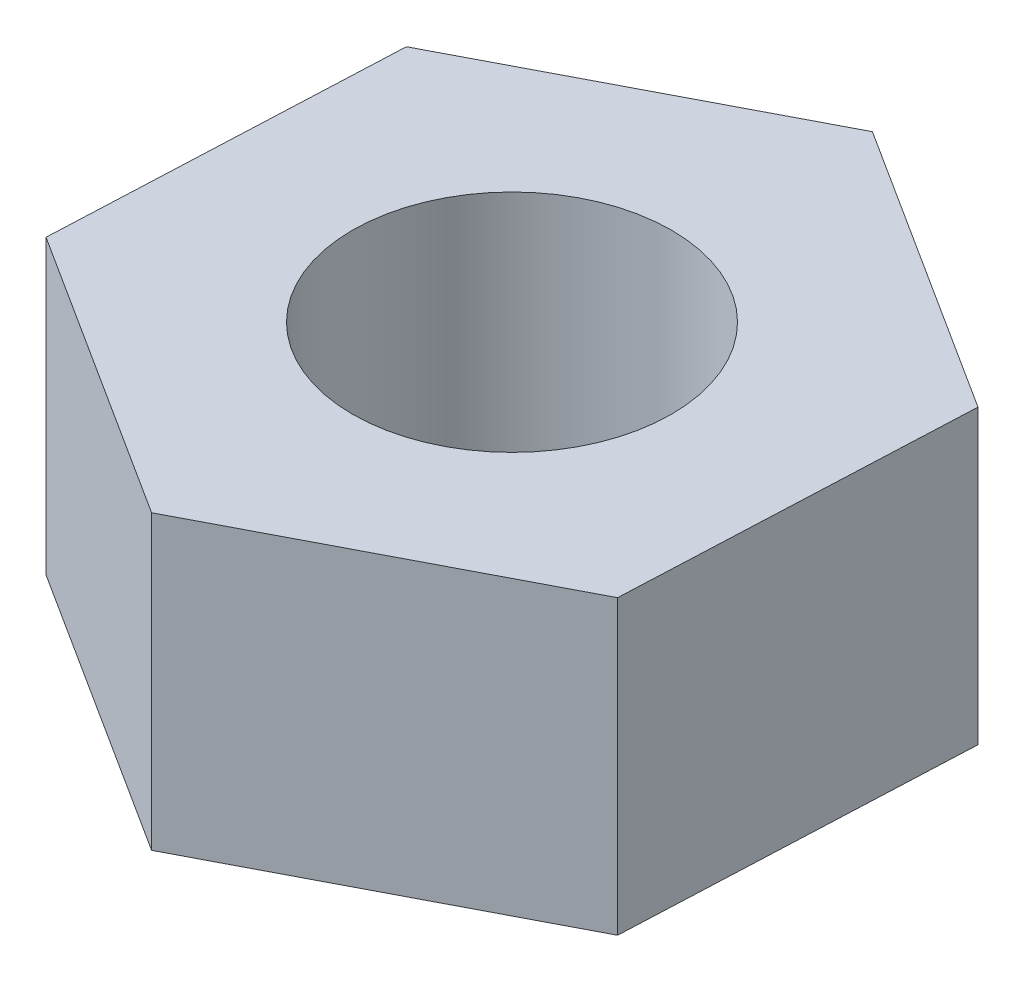
ISO-10303-21;
HEADER;
FILE_DESCRIPTION(('STEP AP214'),'2;1');
FILE_NAME('part.step','',(''),(''),'','','');
FILE_SCHEMA(('AUTOMOTIVE_DESIGN { 1 0 10303 214 1 1 1 1 }'));
ENDSEC;
DATA;
#1=APPLICATION_CONTEXT('core data for automotive mechanical design processes');
#2=APPLICATION_PROTOCOL_DEFINITION('international standard','automotive_design',2000,#1);
#3=PRODUCT_CONTEXT('',#1,'mechanical');
#4=PRODUCT('Part','Part','',(#3));
#5=PRODUCT_RELATED_PRODUCT_CATEGORY('part','',(#4));
#6=PRODUCT_DEFINITION_FORMATION('','',#4);
#7=PRODUCT_DEFINITION_CONTEXT('part definition',#1,'design');
#8=PRODUCT_DEFINITION('design','',#6,#7);
#9=PRODUCT_DEFINITION_SHAPE('','',#8);
#10=(LENGTH_UNIT() NAMED_UNIT(*) SI_UNIT(.MILLI.,.METRE.));
#11=(NAMED_UNIT(*) PLANE_ANGLE_UNIT() SI_UNIT($,.RADIAN.));
#12=(NAMED_UNIT(*) SI_UNIT($,.STERADIAN.) SOLID_ANGLE_UNIT());
#13=UNCERTAINTY_MEASURE_WITH_UNIT(LENGTH_MEASURE(1.E-05),#10,'distance_accuracy_value','');
#14=(GEOMETRIC_REPRESENTATION_CONTEXT(3) GLOBAL_UNCERTAINTY_ASSIGNED_CONTEXT((#13)) GLOBAL_UNIT_ASSIGNED_CONTEXT((#10,
#11,#12)) REPRESENTATION_CONTEXT('',''));
#15=CARTESIAN_POINT('',(0.,0.,0.));
#16=DIRECTION('',(0.,0.,1.));
#17=DIRECTION('',(1.,0.,0.));
#18=AXIS2_PLACEMENT_3D('',#15,#16,#17);
#19=CARTESIAN_POINT('',(-0.285815994218681,5.5,6.49371305321147));
#20=DIRECTION('',(-0.461435786892992,0.,-0.887173610165702));
#21=DIRECTION('',(-0.887173610165702,0.,0.461435786892992));
#22=AXIS2_PLACEMENT_3D('',#19,#20,#21);
#23=PLANE('',#22);
#24=DIRECTION('',(0.887173610165702,0.,-0.461435786892992));
#25=VECTOR('',#24,1.);
#26=CARTESIAN_POINT('',(-0.285815994218681,0.,6.49371305321147));
#27=LINE('',#26,#25);
#28=CARTESIAN_POINT('',(-0.285815994218681,0.,6.49371305321147));
#29=VERTEX_POINT('',#28);
#30=CARTESIAN_POINT('',(5.4808124718584,0.,3.49438043840702));
#31=VERTEX_POINT('',#30);
#32=EDGE_CURVE('E116',#29,#31,#27,.T.);
#33=ORIENTED_EDGE('',*,*,#32,.T.);
#34=DIRECTION('',(0.,-1.,0.));
#35=VECTOR('',#34,1.);
#36=CARTESIAN_POINT('',(5.4808124718584,5.5,3.49438043840702));
#37=LINE('',#36,#35);
#38=CARTESIAN_POINT('',(5.4808124718584,5.5,3.49438043840702));
#39=VERTEX_POINT('',#38);
#40=EDGE_CURVE('E11',#39,#31,#37,.T.);
#41=ORIENTED_EDGE('',*,*,#40,.F.);
#42=DIRECTION('',(0.887173610165702,0.,-0.461435786892992));
#43=VECTOR('',#42,1.);
#44=CARTESIAN_POINT('',(-0.285815994218681,5.5,6.49371305321147));
#45=LINE('',#44,#43);
#46=CARTESIAN_POINT('',(-0.285815994218681,5.5,6.49371305321147));
#47=VERTEX_POINT('',#46);
#48=EDGE_CURVE('E127',#47,#39,#45,.T.);
#49=ORIENTED_EDGE('',*,*,#48,.F.);
#50=DIRECTION('',(0.,-1.,0.));
#51=VECTOR('',#50,1.);
#52=CARTESIAN_POINT('',(-0.285815994218681,5.5,6.49371305321147));
#53=LINE('',#52,#51);
#54=EDGE_CURVE('E112',#47,#29,#53,.T.);
#55=ORIENTED_EDGE('',*,*,#54,.T.);
#56=EDGE_LOOP('',(#33,#41,#49,#55));
#57=FACE_BOUND('',#56,.T.);
#58=ADVANCED_FACE('F32',(#57),#23,.F.);
#59=CARTESIAN_POINT('',(5.4808124718584,5.5,3.49438043840702));
#60=DIRECTION('',(-0.999032777417146,0.,-0.0439716914182564));
#61=DIRECTION('',(-0.0439716914182564,0.,0.999032777417146));
#62=AXIS2_PLACEMENT_3D('',#59,#60,#61);
#63=PLANE('',#62);
#64=DIRECTION('',(0.0439716914182564,0.,-0.999032777417146));
#65=VECTOR('',#64,1.);
#66=CARTESIAN_POINT('',(5.4808124718584,0.,3.49438043840702));
#67=LINE('',#66,#65);
#68=CARTESIAN_POINT('',(5.76662846607707,0.,-2.99933261480445));
#69=VERTEX_POINT('',#68);
#70=EDGE_CURVE('E119',#31,#69,#67,.T.);
#71=ORIENTED_EDGE('',*,*,#70,.T.);
#72=DIRECTION('',(0.,-1.,0.));
#73=VECTOR('',#72,1.);
#74=CARTESIAN_POINT('',(5.76662846607707,5.5,-2.99933261480445));
#75=LINE('',#74,#73);
#76=CARTESIAN_POINT('',(5.76662846607707,5.5,-2.99933261480445));
#77=VERTEX_POINT('',#76);
#78=EDGE_CURVE('E40',#77,#69,#75,.T.);
#79=ORIENTED_EDGE('',*,*,#78,.F.);
#80=DIRECTION('',(0.0439716914182564,0.,-0.999032777417146));
#81=VECTOR('',#80,1.);
#82=CARTESIAN_POINT('',(5.4808124718584,5.5,3.49438043840702));
#83=LINE('',#82,#81);
#84=EDGE_CURVE('E85',#39,#77,#83,.T.);
#85=ORIENTED_EDGE('',*,*,#84,.F.);
#86=ORIENTED_EDGE('',*,*,#40,.T.);
#87=EDGE_LOOP('',(#71,#79,#85,#86));
#88=FACE_BOUND('',#87,.T.);
#89=ADVANCED_FACE('F153',(#88),#63,.F.);
#90=CARTESIAN_POINT('',(5.76662846607707,5.5,-2.99933261480445));
#91=DIRECTION('',(-0.537596990524155,0.,0.843201918747444));
#92=DIRECTION('',(0.843201918747444,0.,0.537596990524155));
#93=AXIS2_PLACEMENT_3D('',#90,#91,#92);
#94=PLANE('',#93);
#95=DIRECTION('',(-0.843201918747444,0.,-0.537596990524155));
#96=VECTOR('',#95,1.);
#97=CARTESIAN_POINT('',(5.76662846607707,0.,-2.99933261480445));
#98=LINE('',#97,#96);
#99=CARTESIAN_POINT('',(0.285815994218677,0.,-6.49371305321146));
#100=VERTEX_POINT('',#99);
#101=EDGE_CURVE('E122',#69,#100,#98,.T.);
#102=ORIENTED_EDGE('',*,*,#101,.T.);
#103=DIRECTION('',(0.,-1.,0.));
#104=VECTOR('',#103,1.);
#105=CARTESIAN_POINT('',(0.285815994218677,5.5,-6.49371305321146));
#106=LINE('',#105,#104);
#107=CARTESIAN_POINT('',(0.285815994218677,5.5,-6.49371305321146));
#108=VERTEX_POINT('',#107);
#109=EDGE_CURVE('E107',#108,#100,#106,.T.);
#110=ORIENTED_EDGE('',*,*,#109,.F.);
#111=DIRECTION('',(-0.843201918747444,0.,-0.537596990524155));
#112=VECTOR('',#111,1.);
#113=CARTESIAN_POINT('',(5.76662846607707,5.5,-2.99933261480445));
#114=LINE('',#113,#112);
#115=EDGE_CURVE('E98',#77,#108,#114,.T.);
#116=ORIENTED_EDGE('',*,*,#115,.F.);
#117=ORIENTED_EDGE('',*,*,#78,.T.);
#118=EDGE_LOOP('',(#102,#110,#116,#117));
#119=FACE_BOUND('',#118,.T.);
#120=ADVANCED_FACE('F133',(#119),#94,.F.);
#121=CARTESIAN_POINT('',(0.285815994218677,5.5,-6.49371305321146));
#122=DIRECTION('',(0.461435786892992,0.,0.887173610165702));
#123=DIRECTION('',(0.887173610165702,0.,-0.461435786892992));
#124=AXIS2_PLACEMENT_3D('',#121,#122,#123);
#125=PLANE('',#124);
#126=DIRECTION('',(-0.887173610165702,0.,0.461435786892992));
#127=VECTOR('',#126,1.);
#128=CARTESIAN_POINT('',(0.285815994218677,0.,-6.49371305321146));
#129=LINE('',#128,#127);
#130=CARTESIAN_POINT('',(-5.48081247185839,0.,-3.49438043840701));
#131=VERTEX_POINT('',#130);
#132=EDGE_CURVE('E106',#100,#131,#129,.T.);
#133=ORIENTED_EDGE('',*,*,#132,.T.);
#134=DIRECTION('',(0.,-1.,0.));
#135=VECTOR('',#134,1.);
#136=CARTESIAN_POINT('',(-5.48081247185839,5.5,-3.49438043840701));
#137=LINE('',#136,#135);
#138=CARTESIAN_POINT('',(-5.48081247185839,5.5,-3.49438043840701));
#139=VERTEX_POINT('',#138);
#140=EDGE_CURVE('E103',#139,#131,#137,.T.);
#141=ORIENTED_EDGE('',*,*,#140,.F.);
#142=DIRECTION('',(-0.887173610165702,0.,0.461435786892992));
#143=VECTOR('',#142,1.);
#144=CARTESIAN_POINT('',(0.285815994218677,5.5,-6.49371305321146));
#145=LINE('',#144,#143);
#146=EDGE_CURVE('E92',#108,#139,#145,.T.);
#147=ORIENTED_EDGE('',*,*,#146,.F.);
#148=ORIENTED_EDGE('',*,*,#109,.T.);
#149=EDGE_LOOP('',(#133,#141,#147,#148));
#150=FACE_BOUND('',#149,.T.);
#151=ADVANCED_FACE('F104',(#150),#125,.F.);
#152=CARTESIAN_POINT('',(-5.48081247185839,5.5,-3.49438043840701));
#153=DIRECTION('',(0.999032777417146,0.,0.0439716914182575));
#154=DIRECTION('',(0.0439716914182575,0.,-0.999032777417146));
#155=AXIS2_PLACEMENT_3D('',#152,#153,#154);
#156=PLANE('',#155);
#157=DIRECTION('',(-0.0439716914182575,0.,0.999032777417146));
#158=VECTOR('',#157,1.);
#159=CARTESIAN_POINT('',(-5.48081247185839,0.,-3.49438043840701));
#160=LINE('',#159,#158);
#161=CARTESIAN_POINT('',(-5.76662846607707,0.,2.99933261480446));
#162=VERTEX_POINT('',#161);
#163=EDGE_CURVE('E71',#131,#162,#160,.T.);
#164=ORIENTED_EDGE('',*,*,#163,.T.);
#165=DIRECTION('',(0.,-1.,0.));
#166=VECTOR('',#165,1.);
#167=CARTESIAN_POINT('',(-5.76662846607707,5.5,2.99933261480446));
#168=LINE('',#167,#166);
#169=CARTESIAN_POINT('',(-5.76662846607707,5.5,2.99933261480446));
#170=VERTEX_POINT('',#169);
#171=EDGE_CURVE('E108',#170,#162,#168,.T.);
#172=ORIENTED_EDGE('',*,*,#171,.F.);
#173=DIRECTION('',(-0.0439716914182575,0.,0.999032777417146));
#174=VECTOR('',#173,1.);
#175=CARTESIAN_POINT('',(-5.48081247185839,5.5,-3.49438043840701));
#176=LINE('',#175,#174);
#177=EDGE_CURVE('E96',#139,#170,#176,.T.);
#178=ORIENTED_EDGE('',*,*,#177,.F.);
#179=ORIENTED_EDGE('',*,*,#140,.T.);
#180=EDGE_LOOP('',(#164,#172,#178,#179));
#181=FACE_BOUND('',#180,.T.);
#182=ADVANCED_FACE('F110',(#181),#156,.F.);
#183=CARTESIAN_POINT('',(-5.76662846607707,5.5,2.99933261480446));
#184=DIRECTION('',(0.537596990524156,0.,-0.843201918747444));
#185=DIRECTION('',(-0.843201918747444,0.,-0.537596990524156));
#186=AXIS2_PLACEMENT_3D('',#183,#184,#185);
#187=PLANE('',#186);
#188=DIRECTION('',(0.843201918747444,0.,0.537596990524156));
#189=VECTOR('',#188,1.);
#190=CARTESIAN_POINT('',(-5.76662846607707,0.,2.99933261480446));
#191=LINE('',#190,#189);
#192=EDGE_CURVE('E77',#162,#29,#191,.T.);
#193=ORIENTED_EDGE('',*,*,#192,.T.);
#194=ORIENTED_EDGE('',*,*,#54,.F.);
#195=DIRECTION('',(0.843201918747444,0.,0.537596990524156));
#196=VECTOR('',#195,1.);
#197=CARTESIAN_POINT('',(-5.76662846607707,5.5,2.99933261480446));
#198=LINE('',#197,#196);
#199=EDGE_CURVE('E48',#170,#47,#198,.T.);
#200=ORIENTED_EDGE('',*,*,#199,.F.);
#201=ORIENTED_EDGE('',*,*,#171,.T.);
#202=EDGE_LOOP('',(#193,#194,#200,#201));
#203=FACE_BOUND('',#202,.T.);
#204=ADVANCED_FACE('F140',(#203),#187,.F.);
#205=CARTESIAN_POINT('',(0.,5.5,0.));
#206=DIRECTION('',(0.,1.,0.));
#207=DIRECTION('',(0.,0.,1.));
#208=AXIS2_PLACEMENT_3D('',#205,#206,#207);
#209=PLANE('',#208);
#210=CARTESIAN_POINT('',(0.,5.5,0.));
#211=DIRECTION('',(0.,1.,0.));
#212=DIRECTION('',(0.,0.,1.));
#213=AXIS2_PLACEMENT_3D('',#210,#211,#212);
#214=CIRCLE('',#213,3.);
#215=CARTESIAN_POINT('',(0.,5.5,3.));
#216=VERTEX_POINT('',#215);
#217=EDGE_CURVE('E207',#216,#216,#214,.T.);
#218=ORIENTED_EDGE('',*,*,#217,.F.);
#219=EDGE_LOOP('',(#218));
#220=FACE_BOUND('',#219,.T.);
#221=ORIENTED_EDGE('',*,*,#48,.T.);
#222=ORIENTED_EDGE('',*,*,#84,.T.);
#223=ORIENTED_EDGE('',*,*,#115,.T.);
#224=ORIENTED_EDGE('',*,*,#146,.T.);
#225=ORIENTED_EDGE('',*,*,#177,.T.);
#226=ORIENTED_EDGE('',*,*,#199,.T.);
#227=EDGE_LOOP('',(#221,#222,#223,#224,#225,#226));
#228=FACE_BOUND('',#227,.T.);
#229=ADVANCED_FACE('F94',(#220,#228),#209,.T.);
#230=CARTESIAN_POINT('',(0.,0.,0.));
#231=DIRECTION('',(0.,1.,0.));
#232=DIRECTION('',(0.,0.,1.));
#233=AXIS2_PLACEMENT_3D('',#230,#231,#232);
#234=PLANE('',#233);
#235=CARTESIAN_POINT('',(0.,0.,0.));
#236=DIRECTION('',(0.,1.,0.));
#237=DIRECTION('',(0.,0.,1.));
#238=AXIS2_PLACEMENT_3D('',#235,#236,#237);
#239=CIRCLE('',#238,3.);
#240=CARTESIAN_POINT('',(0.,0.,3.));
#241=VERTEX_POINT('',#240);
#242=EDGE_CURVE('E120',#241,#241,#239,.T.);
#243=ORIENTED_EDGE('',*,*,#242,.T.);
#244=EDGE_LOOP('',(#243));
#245=FACE_BOUND('',#244,.T.);
#246=ORIENTED_EDGE('',*,*,#32,.F.);
#247=ORIENTED_EDGE('',*,*,#192,.F.);
#248=ORIENTED_EDGE('',*,*,#163,.F.);
#249=ORIENTED_EDGE('',*,*,#132,.F.);
#250=ORIENTED_EDGE('',*,*,#101,.F.);
#251=ORIENTED_EDGE('',*,*,#70,.F.);
#252=EDGE_LOOP('',(#246,#247,#248,#249,#250,#251));
#253=FACE_BOUND('',#252,.T.);
#254=ADVANCED_FACE('F136',(#245,#253),#234,.F.);
#255=CARTESIAN_POINT('',(0.,0.,0.));
#256=DIRECTION('',(0.,1.,0.));
#257=DIRECTION('',(0.,0.,1.));
#258=AXIS2_PLACEMENT_3D('',#255,#256,#257);
#259=CYLINDRICAL_SURFACE('',#258,3.);
#260=ORIENTED_EDGE('',*,*,#242,.F.);
#261=EDGE_LOOP('',(#260));
#262=FACE_BOUND('',#261,.T.);
#263=ORIENTED_EDGE('',*,*,#217,.T.);
#264=EDGE_LOOP('',(#263));
#265=FACE_BOUND('',#264,.T.);
#266=ADVANCED_FACE('F186',(#262,#265),#259,.F.);
#267=CLOSED_SHELL('',(#58,#89,#120,#151,#182,#204,#229,#254,#266));
#268=MANIFOLD_SOLID_BREP('B2',#267);
#269=ADVANCED_BREP_SHAPE_REPRESENTATION('',(#18,#268),#14);
#270=SHAPE_DEFINITION_REPRESENTATION(#9,#269);
ENDSEC;
END-ISO-10303-21;
